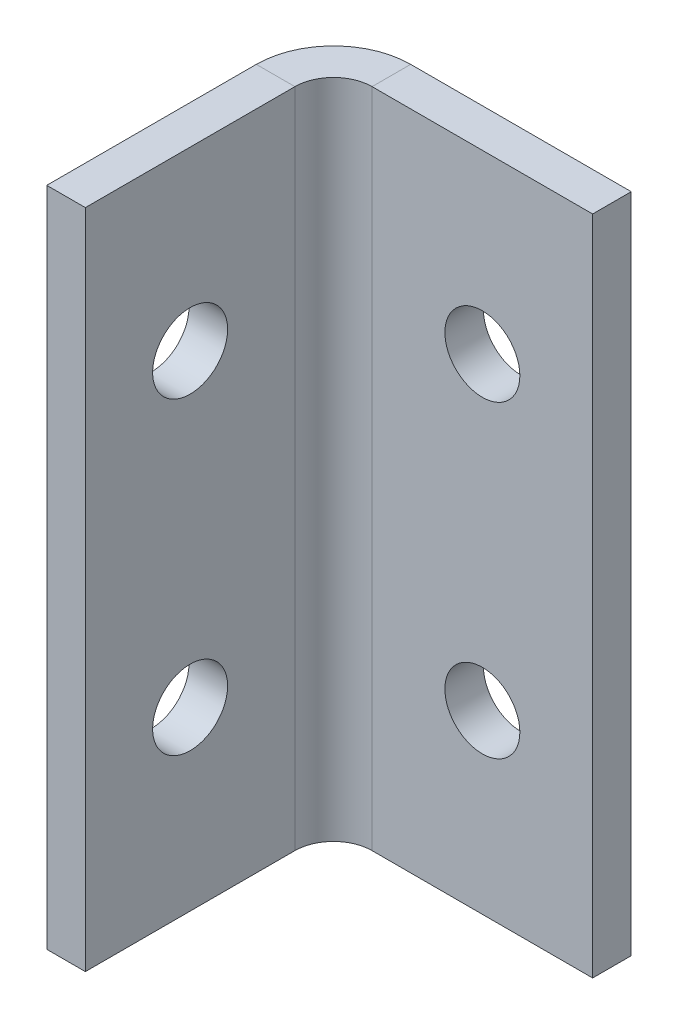
ISO-10303-21;
HEADER;
FILE_DESCRIPTION(('STEP AP214'),'2;1');
FILE_NAME('part.step','',(''),(''),'','','');
FILE_SCHEMA(('AUTOMOTIVE_DESIGN { 1 0 10303 214 1 1 1 1 }'));
ENDSEC;
DATA;
#1=APPLICATION_CONTEXT('core data for automotive mechanical design processes');
#2=APPLICATION_PROTOCOL_DEFINITION('international standard','automotive_design',2000,#1);
#3=PRODUCT_CONTEXT('',#1,'mechanical');
#4=PRODUCT('Part','Part','',(#3));
#5=PRODUCT_RELATED_PRODUCT_CATEGORY('part','',(#4));
#6=PRODUCT_DEFINITION_FORMATION('','',#4);
#7=PRODUCT_DEFINITION_CONTEXT('part definition',#1,'design');
#8=PRODUCT_DEFINITION('design','',#6,#7);
#9=PRODUCT_DEFINITION_SHAPE('','',#8);
#10=(LENGTH_UNIT() NAMED_UNIT(*) SI_UNIT(.MILLI.,.METRE.));
#11=(NAMED_UNIT(*) PLANE_ANGLE_UNIT() SI_UNIT($,.RADIAN.));
#12=(NAMED_UNIT(*) SI_UNIT($,.STERADIAN.) SOLID_ANGLE_UNIT());
#13=UNCERTAINTY_MEASURE_WITH_UNIT(LENGTH_MEASURE(1.E-05),#10,'distance_accuracy_value','');
#14=(GEOMETRIC_REPRESENTATION_CONTEXT(3) GLOBAL_UNCERTAINTY_ASSIGNED_CONTEXT((#13)) GLOBAL_UNIT_ASSIGNED_CONTEXT((#10,
#11,#12)) REPRESENTATION_CONTEXT('',''));
#15=CARTESIAN_POINT('',(0.,0.,0.));
#16=DIRECTION('',(0.,0.,1.));
#17=DIRECTION('',(1.,0.,0.));
#18=AXIS2_PLACEMENT_3D('',#15,#16,#17);
#19=CARTESIAN_POINT('',(0.,30.,-1.75));
#20=DIRECTION('',(0.,1.,0.));
#21=DIRECTION('',(0.,0.,1.));
#22=AXIS2_PLACEMENT_3D('',#19,#20,#21);
#23=PLANE('',#22);
#24=DIRECTION('',(-1.,0.,0.));
#25=VECTOR('',#24,1.);
#26=CARTESIAN_POINT('',(0.,30.,0.));
#27=LINE('',#26,#25);
#28=CARTESIAN_POINT('',(9.99999999999999,30.,0.));
#29=VERTEX_POINT('',#28);
#30=CARTESIAN_POINT('',(0.,30.,0.));
#31=VERTEX_POINT('',#30);
#32=EDGE_CURVE('E226',#29,#31,#27,.T.);
#33=ORIENTED_EDGE('',*,*,#32,.F.);
#34=DIRECTION('',(0.,0.,1.));
#35=VECTOR('',#34,1.);
#36=CARTESIAN_POINT('',(9.99999999999999,30.,-1.75));
#37=LINE('',#36,#35);
#38=CARTESIAN_POINT('',(9.99999999999999,30.,-1.75));
#39=VERTEX_POINT('',#38);
#40=EDGE_CURVE('E76',#39,#29,#37,.T.);
#41=ORIENTED_EDGE('',*,*,#40,.F.);
#42=DIRECTION('',(-1.,0.,0.));
#43=VECTOR('',#42,1.);
#44=CARTESIAN_POINT('',(0.,30.,-1.75));
#45=LINE('',#44,#43);
#46=CARTESIAN_POINT('',(0.,30.,-1.75));
#47=VERTEX_POINT('',#46);
#48=EDGE_CURVE('E233',#39,#47,#45,.T.);
#49=ORIENTED_EDGE('',*,*,#48,.T.);
#50=DIRECTION('',(0.,0.,1.));
#51=VECTOR('',#50,1.);
#52=CARTESIAN_POINT('',(0.,30.,-1.75));
#53=LINE('',#52,#51);
#54=EDGE_CURVE('E13',#47,#31,#53,.T.);
#55=ORIENTED_EDGE('',*,*,#54,.T.);
#56=EDGE_LOOP('',(#33,#41,#49,#55));
#57=FACE_BOUND('',#56,.T.);
#58=ADVANCED_FACE('F66',(#57),#23,.T.);
#59=CARTESIAN_POINT('',(10.,0.,-1.75));
#60=DIRECTION('',(1.,0.,0.));
#61=DIRECTION('',(0.,1.,0.));
#62=AXIS2_PLACEMENT_3D('',#59,#60,#61);
#63=PLANE('',#62);
#64=DIRECTION('',(0.,1.,0.));
#65=VECTOR('',#64,1.);
#66=CARTESIAN_POINT('',(10.,0.,0.));
#67=LINE('',#66,#65);
#68=CARTESIAN_POINT('',(10.,0.,0.));
#69=VERTEX_POINT('',#68);
#70=EDGE_CURVE('E244',#69,#29,#67,.T.);
#71=ORIENTED_EDGE('',*,*,#70,.F.);
#72=DIRECTION('',(0.,0.,1.));
#73=VECTOR('',#72,1.);
#74=CARTESIAN_POINT('',(10.,0.,-1.75));
#75=LINE('',#74,#73);
#76=CARTESIAN_POINT('',(10.,0.,-1.75));
#77=VERTEX_POINT('',#76);
#78=EDGE_CURVE('E116',#77,#69,#75,.T.);
#79=ORIENTED_EDGE('',*,*,#78,.F.);
#80=DIRECTION('',(0.,1.,0.));
#81=VECTOR('',#80,1.);
#82=CARTESIAN_POINT('',(10.,0.,-1.75));
#83=LINE('',#82,#81);
#84=EDGE_CURVE('E230',#77,#39,#83,.T.);
#85=ORIENTED_EDGE('',*,*,#84,.T.);
#86=ORIENTED_EDGE('',*,*,#40,.T.);
#87=EDGE_LOOP('',(#71,#79,#85,#86));
#88=FACE_BOUND('',#87,.T.);
#89=ADVANCED_FACE('F321',(#88),#63,.T.);
#90=CARTESIAN_POINT('',(0.,0.,-1.75));
#91=DIRECTION('',(0.,-1.,0.));
#92=DIRECTION('',(0.,0.,-1.));
#93=AXIS2_PLACEMENT_3D('',#90,#91,#92);
#94=PLANE('',#93);
#95=DIRECTION('',(1.,0.,0.));
#96=VECTOR('',#95,1.);
#97=CARTESIAN_POINT('',(0.,0.,0.));
#98=LINE('',#97,#96);
#99=CARTESIAN_POINT('',(0.,0.,0.));
#100=VERTEX_POINT('',#99);
#101=EDGE_CURVE('E240',#100,#69,#98,.T.);
#102=ORIENTED_EDGE('',*,*,#101,.F.);
#103=DIRECTION('',(0.,0.,1.));
#104=VECTOR('',#103,1.);
#105=CARTESIAN_POINT('',(0.,0.,-1.75));
#106=LINE('',#105,#104);
#107=CARTESIAN_POINT('',(0.,0.,-1.75));
#108=VERTEX_POINT('',#107);
#109=EDGE_CURVE('E236',#108,#100,#106,.T.);
#110=ORIENTED_EDGE('',*,*,#109,.F.);
#111=DIRECTION('',(1.,0.,0.));
#112=VECTOR('',#111,1.);
#113=CARTESIAN_POINT('',(0.,0.,-1.75));
#114=LINE('',#113,#112);
#115=EDGE_CURVE('E225',#108,#77,#114,.T.);
#116=ORIENTED_EDGE('',*,*,#115,.T.);
#117=ORIENTED_EDGE('',*,*,#78,.T.);
#118=EDGE_LOOP('',(#102,#110,#116,#117));
#119=FACE_BOUND('',#118,.T.);
#120=ADVANCED_FACE('F68',(#119),#94,.T.);
#121=CARTESIAN_POINT('',(0.,0.,-1.75));
#122=DIRECTION('',(0.,0.,-1.));
#123=DIRECTION('',(-1.,0.,0.));
#124=AXIS2_PLACEMENT_3D('',#121,#122,#123);
#125=PLANE('',#124);
#126=CARTESIAN_POINT('',(5.,22.,-1.75));
#127=DIRECTION('',(0.,0.,-1.));
#128=DIRECTION('',(-1.,0.,0.));
#129=AXIS2_PLACEMENT_3D('',#126,#127,#128);
#130=CIRCLE('',#129,1.69999999999999);
#131=CARTESIAN_POINT('',(3.30000000000001,22.,-1.75));
#132=VERTEX_POINT('',#131);
#133=EDGE_CURVE('E70',#132,#132,#130,.T.);
#134=ORIENTED_EDGE('',*,*,#133,.F.);
#135=EDGE_LOOP('',(#134));
#136=FACE_BOUND('',#135,.T.);
#137=CARTESIAN_POINT('',(5.,8.,-1.75));
#138=DIRECTION('',(0.,0.,-1.));
#139=DIRECTION('',(-1.,0.,0.));
#140=AXIS2_PLACEMENT_3D('',#137,#138,#139);
#141=CIRCLE('',#140,1.69999999999999);
#142=CARTESIAN_POINT('',(3.30000000000001,8.,-1.75));
#143=VERTEX_POINT('',#142);
#144=EDGE_CURVE('E283',#143,#143,#141,.T.);
#145=ORIENTED_EDGE('',*,*,#144,.F.);
#146=EDGE_LOOP('',(#145));
#147=FACE_BOUND('',#146,.T.);
#148=DIRECTION('',(0.,-1.,0.));
#149=VECTOR('',#148,1.);
#150=CARTESIAN_POINT('',(0.,0.,-1.75));
#151=LINE('',#150,#149);
#152=EDGE_CURVE('E87',#47,#108,#151,.T.);
#153=ORIENTED_EDGE('',*,*,#152,.F.);
#154=ORIENTED_EDGE('',*,*,#48,.F.);
#155=ORIENTED_EDGE('',*,*,#84,.F.);
#156=ORIENTED_EDGE('',*,*,#115,.F.);
#157=EDGE_LOOP('',(#153,#154,#155,#156));
#158=FACE_BOUND('',#157,.T.);
#159=ADVANCED_FACE('F302',(#136,#147,#158),#125,.T.);
#160=CARTESIAN_POINT('',(0.,0.,0.));
#161=DIRECTION('',(0.,0.,-1.));
#162=DIRECTION('',(-1.,0.,0.));
#163=AXIS2_PLACEMENT_3D('',#160,#161,#162);
#164=PLANE('',#163);
#165=CARTESIAN_POINT('',(5.,22.,0.));
#166=DIRECTION('',(0.,0.,1.));
#167=DIRECTION('',(1.,0.,0.));
#168=AXIS2_PLACEMENT_3D('',#165,#166,#167);
#169=CIRCLE('',#168,1.69999999999999);
#170=CARTESIAN_POINT('',(6.69999999999999,22.,0.));
#171=VERTEX_POINT('',#170);
#172=EDGE_CURVE('E291',#171,#171,#169,.T.);
#173=ORIENTED_EDGE('',*,*,#172,.F.);
#174=EDGE_LOOP('',(#173));
#175=FACE_BOUND('',#174,.T.);
#176=CARTESIAN_POINT('',(5.,8.,0.));
#177=DIRECTION('',(0.,0.,1.));
#178=DIRECTION('',(1.,0.,0.));
#179=AXIS2_PLACEMENT_3D('',#176,#177,#178);
#180=CIRCLE('',#179,1.69999999999999);
#181=CARTESIAN_POINT('',(6.69999999999999,8.,0.));
#182=VERTEX_POINT('',#181);
#183=EDGE_CURVE('E287',#182,#182,#180,.T.);
#184=ORIENTED_EDGE('',*,*,#183,.F.);
#185=EDGE_LOOP('',(#184));
#186=FACE_BOUND('',#185,.T.);
#187=DIRECTION('',(0.,-1.,0.));
#188=VECTOR('',#187,1.);
#189=CARTESIAN_POINT('',(0.,0.,0.));
#190=LINE('',#189,#188);
#191=EDGE_CURVE('E210',#31,#100,#190,.T.);
#192=ORIENTED_EDGE('',*,*,#191,.T.);
#193=ORIENTED_EDGE('',*,*,#101,.T.);
#194=ORIENTED_EDGE('',*,*,#70,.T.);
#195=ORIENTED_EDGE('',*,*,#32,.T.);
#196=EDGE_LOOP('',(#192,#193,#194,#195));
#197=FACE_BOUND('',#196,.T.);
#198=ADVANCED_FACE('F305',(#175,#186,#197),#164,.F.);
#199=CARTESIAN_POINT('',(0.,30.,1.75));
#200=DIRECTION('',(0.,1.,0.));
#201=DIRECTION('',(-1.,0.,0.));
#202=AXIS2_PLACEMENT_3D('',#199,#200,#201);
#203=PLANE('',#202);
#204=DIRECTION('',(1.,0.,0.));
#205=VECTOR('',#204,1.);
#206=CARTESIAN_POINT('',(-3.5,30.,1.74999999999999));
#207=LINE('',#206,#205);
#208=CARTESIAN_POINT('',(-1.75000000000001,30.,1.74999999999999));
#209=VERTEX_POINT('',#208);
#210=CARTESIAN_POINT('',(-3.50000000000001,30.,1.74999999999999));
#211=VERTEX_POINT('',#210);
#212=EDGE_CURVE('E180',#209,#211,#207,.F.);
#213=ORIENTED_EDGE('',*,*,#212,.F.);
#214=CARTESIAN_POINT('',(0.,30.,1.75));
#215=DIRECTION('',(0.,-1.,0.));
#216=DIRECTION('',(1.,0.,0.));
#217=AXIS2_PLACEMENT_3D('',#214,#215,#216);
#218=CIRCLE('',#217,1.75);
#219=EDGE_CURVE('E215',#31,#209,#218,.F.);
#220=ORIENTED_EDGE('',*,*,#219,.F.);
#221=ORIENTED_EDGE('',*,*,#54,.F.);
#222=CARTESIAN_POINT('',(0.,30.,1.75));
#223=DIRECTION('',(0.,-1.,0.));
#224=DIRECTION('',(1.,0.,0.));
#225=AXIS2_PLACEMENT_3D('',#222,#223,#224);
#226=CIRCLE('',#225,3.5);
#227=EDGE_CURVE('E206',#47,#211,#226,.F.);
#228=ORIENTED_EDGE('',*,*,#227,.T.);
#229=EDGE_LOOP('',(#213,#220,#221,#228));
#230=FACE_BOUND('',#229,.T.);
#231=ADVANCED_FACE('F318',(#230),#203,.T.);
#232=CARTESIAN_POINT('',(0.,0.,1.75));
#233=DIRECTION('',(0.,1.,0.));
#234=DIRECTION('',(-1.,0.,0.));
#235=AXIS2_PLACEMENT_3D('',#232,#233,#234);
#236=PLANE('',#235);
#237=CARTESIAN_POINT('',(0.,0.,1.75));
#238=DIRECTION('',(0.,-1.,0.));
#239=DIRECTION('',(1.,0.,0.));
#240=AXIS2_PLACEMENT_3D('',#237,#238,#239);
#241=CIRCLE('',#240,1.75);
#242=CARTESIAN_POINT('',(-1.75,0.,1.74999999999999));
#243=VERTEX_POINT('',#242);
#244=EDGE_CURVE('E219',#243,#100,#241,.T.);
#245=ORIENTED_EDGE('',*,*,#244,.F.);
#246=DIRECTION('',(1.,0.,0.));
#247=VECTOR('',#246,1.);
#248=CARTESIAN_POINT('',(-1.75,0.,1.74999999999999));
#249=LINE('',#248,#247);
#250=CARTESIAN_POINT('',(-3.5,0.,1.74999999999999));
#251=VERTEX_POINT('',#250);
#252=EDGE_CURVE('E198',#243,#251,#249,.F.);
#253=ORIENTED_EDGE('',*,*,#252,.T.);
#254=CARTESIAN_POINT('',(0.,0.,1.75));
#255=DIRECTION('',(0.,-1.,0.));
#256=DIRECTION('',(1.,0.,0.));
#257=AXIS2_PLACEMENT_3D('',#254,#255,#256);
#258=CIRCLE('',#257,3.5);
#259=EDGE_CURVE('E211',#251,#108,#258,.T.);
#260=ORIENTED_EDGE('',*,*,#259,.T.);
#261=ORIENTED_EDGE('',*,*,#109,.T.);
#262=EDGE_LOOP('',(#245,#253,#260,#261));
#263=FACE_BOUND('',#262,.T.);
#264=ADVANCED_FACE('F254',(#263),#236,.F.);
#265=CARTESIAN_POINT('',(0.,0.,1.75));
#266=DIRECTION('',(0.,-1.,0.));
#267=DIRECTION('',(-1.,0.,0.));
#268=AXIS2_PLACEMENT_3D('',#265,#266,#267);
#269=CYLINDRICAL_SURFACE('',#268,3.5);
#270=ORIENTED_EDGE('',*,*,#152,.T.);
#271=ORIENTED_EDGE('',*,*,#259,.F.);
#272=DIRECTION('',(0.,-1.,0.));
#273=VECTOR('',#272,1.);
#274=CARTESIAN_POINT('',(-3.5,30.,1.74999999999999));
#275=LINE('',#274,#273);
#276=EDGE_CURVE('E195',#251,#211,#275,.F.);
#277=ORIENTED_EDGE('',*,*,#276,.T.);
#278=ORIENTED_EDGE('',*,*,#227,.F.);
#279=EDGE_LOOP('',(#270,#271,#277,#278));
#280=FACE_BOUND('',#279,.T.);
#281=ADVANCED_FACE('F332',(#280),#269,.T.);
#282=CARTESIAN_POINT('',(0.,0.,1.75));
#283=DIRECTION('',(0.,-1.,0.));
#284=DIRECTION('',(-1.,0.,0.));
#285=AXIS2_PLACEMENT_3D('',#282,#283,#284);
#286=CYLINDRICAL_SURFACE('',#285,1.75);
#287=ORIENTED_EDGE('',*,*,#191,.F.);
#288=ORIENTED_EDGE('',*,*,#219,.T.);
#289=DIRECTION('',(0.,-1.,0.));
#290=VECTOR('',#289,1.);
#291=CARTESIAN_POINT('',(-1.75000000000001,30.,1.74999999999999));
#292=LINE('',#291,#290);
#293=EDGE_CURVE('E201',#209,#243,#292,.T.);
#294=ORIENTED_EDGE('',*,*,#293,.T.);
#295=ORIENTED_EDGE('',*,*,#244,.T.);
#296=EDGE_LOOP('',(#287,#288,#294,#295));
#297=FACE_BOUND('',#296,.T.);
#298=ADVANCED_FACE('F259',(#297),#286,.F.);
#299=CARTESIAN_POINT('',(-3.50000000000003,0.,11.25));
#300=DIRECTION('',(0.,1.,0.));
#301=DIRECTION('',(-1.,0.,0.));
#302=AXIS2_PLACEMENT_3D('',#299,#300,#301);
#303=PLANE('',#302);
#304=ORIENTED_EDGE('',*,*,#252,.F.);
#305=DIRECTION('',(0.,0.,-1.));
#306=VECTOR('',#305,1.);
#307=CARTESIAN_POINT('',(-1.75000000000003,0.,11.25));
#308=LINE('',#307,#306);
#309=CARTESIAN_POINT('',(-1.75000000000003,0.,11.25));
#310=VERTEX_POINT('',#309);
#311=EDGE_CURVE('E192',#243,#310,#308,.F.);
#312=ORIENTED_EDGE('',*,*,#311,.T.);
#313=DIRECTION('',(1.,0.,0.));
#314=VECTOR('',#313,1.);
#315=CARTESIAN_POINT('',(-3.50000000000003,0.,11.25));
#316=LINE('',#315,#314);
#317=CARTESIAN_POINT('',(-3.50000000000003,0.,11.25));
#318=VERTEX_POINT('',#317);
#319=EDGE_CURVE('E176',#318,#310,#316,.T.);
#320=ORIENTED_EDGE('',*,*,#319,.F.);
#321=DIRECTION('',(0.,0.,1.));
#322=VECTOR('',#321,1.);
#323=CARTESIAN_POINT('',(-3.49999999999999,0.,0.));
#324=LINE('',#323,#322);
#325=EDGE_CURVE('E162',#251,#318,#324,.T.);
#326=ORIENTED_EDGE('',*,*,#325,.F.);
#327=EDGE_LOOP('',(#304,#312,#320,#326));
#328=FACE_BOUND('',#327,.T.);
#329=ADVANCED_FACE('F266',(#328),#303,.F.);
#330=CARTESIAN_POINT('',(-3.5,30.,0.));
#331=DIRECTION('',(0.,-1.,0.));
#332=DIRECTION('',(1.,0.,0.));
#333=AXIS2_PLACEMENT_3D('',#330,#331,#332);
#334=PLANE('',#333);
#335=ORIENTED_EDGE('',*,*,#212,.T.);
#336=DIRECTION('',(0.,0.,-1.));
#337=VECTOR('',#336,1.);
#338=CARTESIAN_POINT('',(-3.5,30.,0.));
#339=LINE('',#338,#337);
#340=CARTESIAN_POINT('',(-3.50000000000004,30.,11.25));
#341=VERTEX_POINT('',#340);
#342=EDGE_CURVE('E160',#341,#211,#339,.T.);
#343=ORIENTED_EDGE('',*,*,#342,.F.);
#344=DIRECTION('',(1.,0.,0.));
#345=VECTOR('',#344,1.);
#346=CARTESIAN_POINT('',(-3.50000000000004,30.,11.25));
#347=LINE('',#346,#345);
#348=CARTESIAN_POINT('',(-1.75000000000004,30.,11.25));
#349=VERTEX_POINT('',#348);
#350=EDGE_CURVE('E169',#341,#349,#347,.T.);
#351=ORIENTED_EDGE('',*,*,#350,.T.);
#352=DIRECTION('',(0.,0.,1.));
#353=VECTOR('',#352,1.);
#354=CARTESIAN_POINT('',(-1.75,30.,0.));
#355=LINE('',#354,#353);
#356=EDGE_CURVE('E188',#349,#209,#355,.F.);
#357=ORIENTED_EDGE('',*,*,#356,.T.);
#358=EDGE_LOOP('',(#335,#343,#351,#357));
#359=FACE_BOUND('',#358,.T.);
#360=ADVANCED_FACE('F179',(#359),#334,.F.);
#361=CARTESIAN_POINT('',(-3.49999999999999,0.,0.));
#362=DIRECTION('',(1.,0.,0.));
#363=DIRECTION('',(0.,0.,-1.));
#364=AXIS2_PLACEMENT_3D('',#361,#362,#363);
#365=PLANE('',#364);
#366=CARTESIAN_POINT('',(-3.50000000000002,22.,6.49999999999999));
#367=DIRECTION('',(1.,0.,0.));
#368=DIRECTION('',(0.,0.,-1.));
#369=AXIS2_PLACEMENT_3D('',#366,#367,#368);
#370=CIRCLE('',#369,1.69999999999999);
#371=CARTESIAN_POINT('',(-3.50000000000001,22.,4.8));
#372=VERTEX_POINT('',#371);
#373=EDGE_CURVE('E275',#372,#372,#370,.T.);
#374=ORIENTED_EDGE('',*,*,#373,.T.);
#375=EDGE_LOOP('',(#374));
#376=FACE_BOUND('',#375,.T.);
#377=CARTESIAN_POINT('',(-3.50000000000002,8.,6.49999999999999));
#378=DIRECTION('',(1.,0.,0.));
#379=DIRECTION('',(0.,0.,-1.));
#380=AXIS2_PLACEMENT_3D('',#377,#378,#379);
#381=CIRCLE('',#380,1.69999999999999);
#382=CARTESIAN_POINT('',(-3.50000000000001,8.,4.8));
#383=VERTEX_POINT('',#382);
#384=EDGE_CURVE('E205',#383,#383,#381,.T.);
#385=ORIENTED_EDGE('',*,*,#384,.T.);
#386=EDGE_LOOP('',(#385));
#387=FACE_BOUND('',#386,.T.);
#388=ORIENTED_EDGE('',*,*,#276,.F.);
#389=ORIENTED_EDGE('',*,*,#325,.T.);
#390=DIRECTION('',(0.,1.,0.));
#391=VECTOR('',#390,1.);
#392=CARTESIAN_POINT('',(-3.50000000000003,0.,11.25));
#393=LINE('',#392,#391);
#394=EDGE_CURVE('E155',#318,#341,#393,.T.);
#395=ORIENTED_EDGE('',*,*,#394,.T.);
#396=ORIENTED_EDGE('',*,*,#342,.T.);
#397=EDGE_LOOP('',(#388,#389,#395,#396));
#398=FACE_BOUND('',#397,.T.);
#399=ADVANCED_FACE('F158',(#376,#387,#398),#365,.F.);
#400=CARTESIAN_POINT('',(-1.74999999999999,0.,0.));
#401=DIRECTION('',(1.,0.,0.));
#402=DIRECTION('',(0.,0.,-1.));
#403=AXIS2_PLACEMENT_3D('',#400,#401,#402);
#404=PLANE('',#403);
#405=CARTESIAN_POINT('',(-1.75000000000002,22.,6.5));
#406=DIRECTION('',(1.,0.,0.));
#407=DIRECTION('',(0.,0.,-1.));
#408=AXIS2_PLACEMENT_3D('',#405,#406,#407);
#409=CIRCLE('',#408,1.69999999999999);
#410=CARTESIAN_POINT('',(-1.75000000000001,22.,4.80000000000001));
#411=VERTEX_POINT('',#410);
#412=EDGE_CURVE('E279',#411,#411,#409,.T.);
#413=ORIENTED_EDGE('',*,*,#412,.F.);
#414=EDGE_LOOP('',(#413));
#415=FACE_BOUND('',#414,.T.);
#416=CARTESIAN_POINT('',(-1.75000000000002,8.,6.5));
#417=DIRECTION('',(1.,0.,0.));
#418=DIRECTION('',(0.,0.,-1.));
#419=AXIS2_PLACEMENT_3D('',#416,#417,#418);
#420=CIRCLE('',#419,1.69999999999999);
#421=CARTESIAN_POINT('',(-1.75000000000001,8.,4.80000000000001));
#422=VERTEX_POINT('',#421);
#423=EDGE_CURVE('E271',#422,#422,#420,.T.);
#424=ORIENTED_EDGE('',*,*,#423,.F.);
#425=EDGE_LOOP('',(#424));
#426=FACE_BOUND('',#425,.T.);
#427=ORIENTED_EDGE('',*,*,#311,.F.);
#428=ORIENTED_EDGE('',*,*,#293,.F.);
#429=ORIENTED_EDGE('',*,*,#356,.F.);
#430=DIRECTION('',(0.,-1.,0.));
#431=VECTOR('',#430,1.);
#432=CARTESIAN_POINT('',(-1.75000000000004,30.,11.25));
#433=LINE('',#432,#431);
#434=EDGE_CURVE('E172',#310,#349,#433,.F.);
#435=ORIENTED_EDGE('',*,*,#434,.F.);
#436=EDGE_LOOP('',(#427,#428,#429,#435));
#437=FACE_BOUND('',#436,.T.);
#438=ADVANCED_FACE('F264',(#415,#426,#437),#404,.T.);
#439=CARTESIAN_POINT('',(-3.50000000000004,30.,11.25));
#440=DIRECTION('',(0.,0.,-1.));
#441=DIRECTION('',(-1.,0.,0.));
#442=AXIS2_PLACEMENT_3D('',#439,#440,#441);
#443=PLANE('',#442);
#444=ORIENTED_EDGE('',*,*,#434,.T.);
#445=ORIENTED_EDGE('',*,*,#350,.F.);
#446=ORIENTED_EDGE('',*,*,#394,.F.);
#447=ORIENTED_EDGE('',*,*,#319,.T.);
#448=EDGE_LOOP('',(#444,#445,#446,#447));
#449=FACE_BOUND('',#448,.T.);
#450=ADVANCED_FACE('F170',(#449),#443,.F.);
#451=CARTESIAN_POINT('',(-1.75000000000002,8.,6.5));
#452=DIRECTION('',(1.,0.,0.));
#453=DIRECTION('',(0.,0.,-1.));
#454=AXIS2_PLACEMENT_3D('',#451,#452,#453);
#455=CYLINDRICAL_SURFACE('',#454,1.69999999999999);
#456=ORIENTED_EDGE('',*,*,#423,.T.);
#457=EDGE_LOOP('',(#456));
#458=FACE_BOUND('',#457,.T.);
#459=ORIENTED_EDGE('',*,*,#384,.F.);
#460=EDGE_LOOP('',(#459));
#461=FACE_BOUND('',#460,.T.);
#462=ADVANCED_FACE('F344',(#458,#461),#455,.F.);
#463=CARTESIAN_POINT('',(-1.75000000000002,22.,6.5));
#464=DIRECTION('',(1.,0.,0.));
#465=DIRECTION('',(0.,0.,-1.));
#466=AXIS2_PLACEMENT_3D('',#463,#464,#465);
#467=CYLINDRICAL_SURFACE('',#466,1.69999999999999);
#468=ORIENTED_EDGE('',*,*,#412,.T.);
#469=EDGE_LOOP('',(#468));
#470=FACE_BOUND('',#469,.T.);
#471=ORIENTED_EDGE('',*,*,#373,.F.);
#472=EDGE_LOOP('',(#471));
#473=FACE_BOUND('',#472,.T.);
#474=ADVANCED_FACE('F312',(#470,#473),#467,.F.);
#475=CARTESIAN_POINT('',(5.,8.,0.));
#476=DIRECTION('',(0.,0.,1.));
#477=DIRECTION('',(1.,0.,0.));
#478=AXIS2_PLACEMENT_3D('',#475,#476,#477);
#479=CYLINDRICAL_SURFACE('',#478,1.69999999999999);
#480=ORIENTED_EDGE('',*,*,#144,.T.);
#481=EDGE_LOOP('',(#480));
#482=FACE_BOUND('',#481,.T.);
#483=ORIENTED_EDGE('',*,*,#183,.T.);
#484=EDGE_LOOP('',(#483));
#485=FACE_BOUND('',#484,.T.);
#486=ADVANCED_FACE('F309',(#482,#485),#479,.F.);
#487=CARTESIAN_POINT('',(5.,22.,0.));
#488=DIRECTION('',(0.,0.,1.));
#489=DIRECTION('',(1.,0.,0.));
#490=AXIS2_PLACEMENT_3D('',#487,#488,#489);
#491=CYLINDRICAL_SURFACE('',#490,1.69999999999999);
#492=ORIENTED_EDGE('',*,*,#133,.T.);
#493=EDGE_LOOP('',(#492));
#494=FACE_BOUND('',#493,.T.);
#495=ORIENTED_EDGE('',*,*,#172,.T.);
#496=EDGE_LOOP('',(#495));
#497=FACE_BOUND('',#496,.T.);
#498=ADVANCED_FACE('F300',(#494,#497),#491,.F.);
#499=CLOSED_SHELL('',(#58,#89,#120,#159,#198,#231,#264,#281,#298,#329,#360,#399,#438,#450,#462,
#474,#486,#498));
#500=MANIFOLD_SOLID_BREP('B2',#499);
#501=ADVANCED_BREP_SHAPE_REPRESENTATION('',(#18,#500),#14);
#502=SHAPE_DEFINITION_REPRESENTATION(#9,#501);
ENDSEC;
END-ISO-10303-21;
